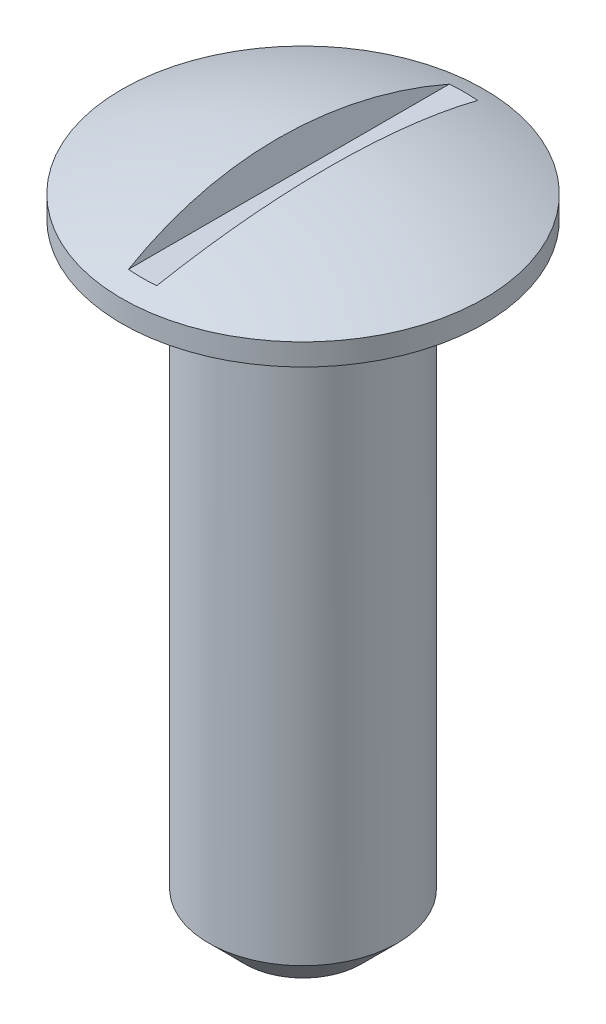
ISO-10303-21;
HEADER;
FILE_DESCRIPTION(('STEP AP214'),'2;1');
FILE_NAME('part.step','',(''),(''),'','','');
FILE_SCHEMA(('AUTOMOTIVE_DESIGN { 1 0 10303 214 1 1 1 1 }'));
ENDSEC;
DATA;
#1=APPLICATION_CONTEXT('core data for automotive mechanical design processes');
#2=APPLICATION_PROTOCOL_DEFINITION('international standard','automotive_design',2000,#1);
#3=PRODUCT_CONTEXT('',#1,'mechanical');
#4=PRODUCT('Part','Part','',(#3));
#5=PRODUCT_RELATED_PRODUCT_CATEGORY('part','',(#4));
#6=PRODUCT_DEFINITION_FORMATION('','',#4);
#7=PRODUCT_DEFINITION_CONTEXT('part definition',#1,'design');
#8=PRODUCT_DEFINITION('design','',#6,#7);
#9=PRODUCT_DEFINITION_SHAPE('','',#8);
#10=(LENGTH_UNIT() NAMED_UNIT(*) SI_UNIT(.MILLI.,.METRE.));
#11=(NAMED_UNIT(*) PLANE_ANGLE_UNIT() SI_UNIT($,.RADIAN.));
#12=(NAMED_UNIT(*) SI_UNIT($,.STERADIAN.) SOLID_ANGLE_UNIT());
#13=UNCERTAINTY_MEASURE_WITH_UNIT(LENGTH_MEASURE(1.E-05),#10,'distance_accuracy_value','');
#14=(GEOMETRIC_REPRESENTATION_CONTEXT(3) GLOBAL_UNCERTAINTY_ASSIGNED_CONTEXT((#13)) GLOBAL_UNIT_ASSIGNED_CONTEXT((#10,
#11,#12)) REPRESENTATION_CONTEXT('',''));
#15=CARTESIAN_POINT('',(0.,0.,0.));
#16=DIRECTION('',(0.,0.,1.));
#17=DIRECTION('',(1.,0.,0.));
#18=AXIS2_PLACEMENT_3D('',#15,#16,#17);
#19=CARTESIAN_POINT('',(0.,-0.363563829787234,0.));
#20=DIRECTION('',(0.,0.,1.));
#21=DIRECTION('',(1.,0.,0.));
#22=AXIS2_PLACEMENT_3D('',#19,#20,#21);
#23=SPHERICAL_SURFACE('',#22,1.3);
#24=CARTESIAN_POINT('',(0.385544529543275,-0.210368812943749,0.));
#25=DIRECTION('',(-0.92932438457048,-0.369264387996863,0.));
#26=DIRECTION('',(0.369264387996863,-0.92932438457048,0.));
#27=AXIS2_PLACEMENT_3D('',#24,#25,#26);
#28=CIRCLE('',#27,1.23202544720212);
#29=CARTESIAN_POINT('',(-0.039027181688126,0.858147017641866,-0.442605337025607));
#30=VERTEX_POINT('',#29);
#31=CARTESIAN_POINT('',(-0.039027181688126,0.858147017641866,0.442605337025607));
#32=VERTEX_POINT('',#31);
#33=EDGE_CURVE('E58',#30,#32,#28,.F.);
#34=ORIENTED_EDGE('',*,*,#33,.F.);
#35=CARTESIAN_POINT('',(0.,0.858147017641866,0.));
#36=DIRECTION('',(0.,-1.,0.));
#37=DIRECTION('',(0.,0.,-1.));
#38=AXIS2_PLACEMENT_3D('',#35,#36,#37);
#39=CIRCLE('',#38,0.444322636463718);
#40=CARTESIAN_POINT('',(0.039027181688126,0.858147017641866,-0.442605337025606));
#41=VERTEX_POINT('',#40);
#42=EDGE_CURVE('E66',#41,#30,#39,.F.);
#43=ORIENTED_EDGE('',*,*,#42,.F.);
#44=CARTESIAN_POINT('',(-0.385544529543274,-0.210368812943749,0.));
#45=DIRECTION('',(0.92932438457048,-0.369264387996863,0.));
#46=DIRECTION('',(0.369264387996863,0.92932438457048,0.));
#47=AXIS2_PLACEMENT_3D('',#44,#45,#46);
#48=CIRCLE('',#47,1.23202544720212);
#49=CARTESIAN_POINT('',(0.039027181688126,0.858147017641866,0.442605337025606));
#50=VERTEX_POINT('',#49);
#51=EDGE_CURVE('E64',#50,#41,#48,.F.);
#52=ORIENTED_EDGE('',*,*,#51,.F.);
#53=EDGE_CURVE('E54',#32,#50,#39,.F.);
#54=ORIENTED_EDGE('',*,*,#53,.F.);
#55=EDGE_LOOP('',(#34,#43,#52,#54));
#56=FACE_BOUND('',#55,.T.);
#57=CARTESIAN_POINT('',(0.,0.836436170212766,0.));
#58=DIRECTION('',(0.,1.,0.));
#59=DIRECTION('',(-1.,0.,0.));
#60=AXIS2_PLACEMENT_3D('',#57,#58,#59);
#61=CIRCLE('',#60,0.5);
#62=CARTESIAN_POINT('',(-0.5,0.836436170212766,0.));
#63=VERTEX_POINT('',#62);
#64=EDGE_CURVE('E70',#63,#63,#61,.T.);
#65=ORIENTED_EDGE('',*,*,#64,.T.);
#66=EDGE_LOOP('',(#65));
#67=FACE_BOUND('',#66,.T.);
#68=ADVANCED_FACE('F38',(#56,#67),#23,.T.);
#69=CARTESIAN_POINT('',(0.,1.28856382978723,0.));
#70=DIRECTION('',(0.,1.,0.));
#71=DIRECTION('',(-1.,0.,0.));
#72=AXIS2_PLACEMENT_3D('',#69,#70,#71);
#73=CYLINDRICAL_SURFACE('',#72,0.5);
#74=CARTESIAN_POINT('',(0.,0.776436170212766,0.));
#75=DIRECTION('',(0.,1.,0.));
#76=DIRECTION('',(-1.,0.,0.));
#77=AXIS2_PLACEMENT_3D('',#74,#75,#76);
#78=CIRCLE('',#77,0.5);
#79=CARTESIAN_POINT('',(-0.5,0.776436170212766,0.));
#80=VERTEX_POINT('',#79);
#81=EDGE_CURVE('E86',#80,#80,#78,.T.);
#82=ORIENTED_EDGE('',*,*,#81,.T.);
#83=EDGE_LOOP('',(#82));
#84=FACE_BOUND('',#83,.T.);
#85=ORIENTED_EDGE('',*,*,#64,.F.);
#86=EDGE_LOOP('',(#85));
#87=FACE_BOUND('',#86,.T.);
#88=ADVANCED_FACE('F105',(#84,#87),#73,.T.);
#89=CARTESIAN_POINT('',(-0.5,0.776436170212766,0.));
#90=DIRECTION('',(0.,-1.,0.));
#91=DIRECTION('',(1.,0.,0.));
#92=AXIS2_PLACEMENT_3D('',#89,#90,#91);
#93=PLANE('',#92);
#94=CARTESIAN_POINT('',(0.,0.776436170212766,0.));
#95=DIRECTION('',(0.,1.,0.));
#96=DIRECTION('',(-1.,0.,0.));
#97=AXIS2_PLACEMENT_3D('',#94,#95,#96);
#98=CIRCLE('',#97,0.260372340425532);
#99=CARTESIAN_POINT('',(-0.260372340425532,0.776436170212766,0.));
#100=VERTEX_POINT('',#99);
#101=EDGE_CURVE('E81',#100,#100,#98,.T.);
#102=ORIENTED_EDGE('',*,*,#101,.T.);
#103=EDGE_LOOP('',(#102));
#104=FACE_BOUND('',#103,.T.);
#105=ORIENTED_EDGE('',*,*,#81,.F.);
#106=EDGE_LOOP('',(#105));
#107=FACE_BOUND('',#106,.T.);
#108=ADVANCED_FACE('F109',(#104,#107),#93,.T.);
#109=CARTESIAN_POINT('',(0.,1.28856382978723,0.));
#110=DIRECTION('',(0.,1.,0.));
#111=DIRECTION('',(-1.,0.,0.));
#112=AXIS2_PLACEMENT_3D('',#109,#110,#111);
#113=CYLINDRICAL_SURFACE('',#112,0.260372340425532);
#114=CARTESIAN_POINT('',(0.,-0.823563829787234,0.));
#115=DIRECTION('',(0.,-1.,0.));
#116=DIRECTION('',(1.,0.,0.));
#117=AXIS2_PLACEMENT_3D('',#114,#115,#116);
#118=CIRCLE('',#117,0.260372340425532);
#119=CARTESIAN_POINT('',(0.260372340425532,-0.823563829787234,0.));
#120=VERTEX_POINT('',#119);
#121=EDGE_CURVE('E47',#120,#120,#118,.F.);
#122=ORIENTED_EDGE('',*,*,#121,.T.);
#123=EDGE_LOOP('',(#122));
#124=FACE_BOUND('',#123,.T.);
#125=ORIENTED_EDGE('',*,*,#101,.F.);
#126=EDGE_LOOP('',(#125));
#127=FACE_BOUND('',#126,.T.);
#128=ADVANCED_FACE('F94',(#124,#127),#113,.T.);
#129=CARTESIAN_POINT('',(-0.260372340425532,-0.923563829787234,0.));
#130=DIRECTION('',(0.,-1.,0.));
#131=DIRECTION('',(1.,0.,0.));
#132=AXIS2_PLACEMENT_3D('',#129,#130,#131);
#133=PLANE('',#132);
#134=CARTESIAN_POINT('',(0.,-0.923563829787234,0.));
#135=DIRECTION('',(0.,-1.,0.));
#136=DIRECTION('',(1.,0.,0.));
#137=AXIS2_PLACEMENT_3D('',#134,#135,#136);
#138=CIRCLE('',#137,0.160372340425531);
#139=CARTESIAN_POINT('',(0.160372340425531,-0.923563829787234,0.));
#140=VERTEX_POINT('',#139);
#141=EDGE_CURVE('E11',#140,#140,#138,.T.);
#142=ORIENTED_EDGE('',*,*,#141,.T.);
#143=EDGE_LOOP('',(#142));
#144=FACE_BOUND('',#143,.T.);
#145=ADVANCED_FACE('F118',(#144),#133,.T.);
#146=CARTESIAN_POINT('',(-0.069398593214377,0.93458247755253,2.92072336930425));
#147=DIRECTION('',(-0.92932438457048,-0.369264387996863,0.));
#148=DIRECTION('',(0.369264387996863,-0.92932438457048,0.));
#149=AXIS2_PLACEMENT_3D('',#146,#147,#148);
#150=PLANE('',#149);
#151=DIRECTION('',(0.,0.,-1.));
#152=VECTOR('',#151,1.);
#153=CARTESIAN_POINT('',(-0.039027181688126,0.858147017641866,2.92072336930425));
#154=LINE('',#153,#152);
#155=EDGE_CURVE('E77',#32,#30,#154,.T.);
#156=ORIENTED_EDGE('',*,*,#155,.T.);
#157=ORIENTED_EDGE('',*,*,#33,.T.);
#158=EDGE_LOOP('',(#156,#157));
#159=FACE_BOUND('',#158,.T.);
#160=ADVANCED_FACE('F121',(#159),#150,.F.);
#161=CARTESIAN_POINT('',(-0.039027181688126,0.858147017641866,2.92072336930425));
#162=DIRECTION('',(0.,-1.,0.));
#163=DIRECTION('',(0.,0.,-1.));
#164=AXIS2_PLACEMENT_3D('',#161,#162,#163);
#165=PLANE('',#164);
#166=ORIENTED_EDGE('',*,*,#155,.F.);
#167=ORIENTED_EDGE('',*,*,#53,.T.);
#168=DIRECTION('',(0.,0.,-1.));
#169=VECTOR('',#168,1.);
#170=CARTESIAN_POINT('',(0.039027181688126,0.858147017641866,2.92072336930425));
#171=LINE('',#170,#169);
#172=EDGE_CURVE('E75',#50,#41,#171,.T.);
#173=ORIENTED_EDGE('',*,*,#172,.T.);
#174=ORIENTED_EDGE('',*,*,#42,.T.);
#175=EDGE_LOOP('',(#166,#167,#173,#174));
#176=FACE_BOUND('',#175,.T.);
#177=ADVANCED_FACE('F74',(#176),#165,.F.);
#178=CARTESIAN_POINT('',(0.069398593214377,0.93458247755253,2.92072336930425));
#179=DIRECTION('',(0.92932438457048,-0.369264387996863,0.));
#180=DIRECTION('',(0.369264387996863,0.92932438457048,0.));
#181=AXIS2_PLACEMENT_3D('',#178,#179,#180);
#182=PLANE('',#181);
#183=ORIENTED_EDGE('',*,*,#51,.T.);
#184=ORIENTED_EDGE('',*,*,#172,.F.);
#185=EDGE_LOOP('',(#183,#184));
#186=FACE_BOUND('',#185,.T.);
#187=ADVANCED_FACE('F79',(#186),#182,.F.);
#188=CARTESIAN_POINT('',(0.,-0.823563829787234,0.));
#189=DIRECTION('',(0.,1.,0.));
#190=DIRECTION('',(-1.,0.,0.));
#191=AXIS2_PLACEMENT_3D('',#188,#189,#190);
#192=CONICAL_SURFACE('',#191,0.260372340425532,0.785398163397451);
#193=ORIENTED_EDGE('',*,*,#141,.F.);
#194=EDGE_LOOP('',(#193));
#195=FACE_BOUND('',#194,.T.);
#196=ORIENTED_EDGE('',*,*,#121,.F.);
#197=EDGE_LOOP('',(#196));
#198=FACE_BOUND('',#197,.T.);
#199=ADVANCED_FACE('F41',(#195,#198),#192,.T.);
#200=CLOSED_SHELL('',(#68,#88,#108,#128,#145,#160,#177,#187,#199));
#201=MANIFOLD_SOLID_BREP('B2',#200);
#202=ADVANCED_BREP_SHAPE_REPRESENTATION('',(#18,#201),#14);
#203=SHAPE_DEFINITION_REPRESENTATION(#9,#202);
ENDSEC;
END-ISO-10303-21;
